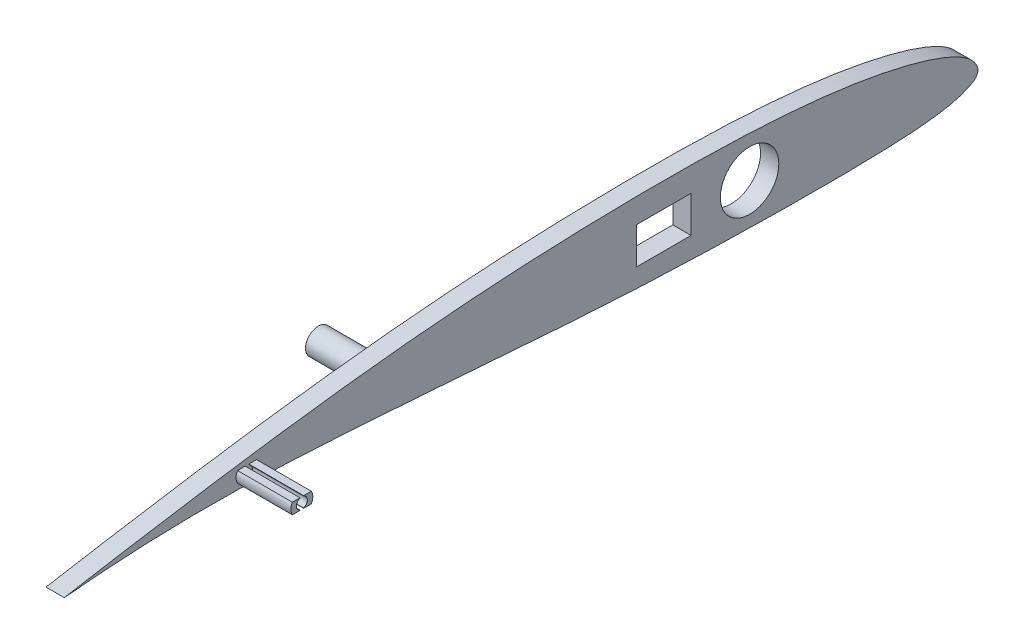
ISO-10303-21;
HEADER;
FILE_DESCRIPTION(('STEP AP214'),'2;1');
FILE_NAME('part.step','',(''),(''),'','','');
FILE_SCHEMA(('AUTOMOTIVE_DESIGN { 1 0 10303 214 1 1 1 1 }'));
ENDSEC;
DATA;
#1=APPLICATION_CONTEXT('core data for automotive mechanical design processes');
#2=APPLICATION_PROTOCOL_DEFINITION('international standard','automotive_design',2000,#1);
#3=PRODUCT_CONTEXT('',#1,'mechanical');
#4=PRODUCT('Part','Part','',(#3));
#5=PRODUCT_RELATED_PRODUCT_CATEGORY('part','',(#4));
#6=PRODUCT_DEFINITION_FORMATION('','',#4);
#7=PRODUCT_DEFINITION_CONTEXT('part definition',#1,'design');
#8=PRODUCT_DEFINITION('design','',#6,#7);
#9=PRODUCT_DEFINITION_SHAPE('','',#8);
#10=(LENGTH_UNIT() NAMED_UNIT(*) SI_UNIT(.MILLI.,.METRE.));
#11=(NAMED_UNIT(*) PLANE_ANGLE_UNIT() SI_UNIT($,.RADIAN.));
#12=(NAMED_UNIT(*) SI_UNIT($,.STERADIAN.) SOLID_ANGLE_UNIT());
#13=UNCERTAINTY_MEASURE_WITH_UNIT(LENGTH_MEASURE(1.E-05),#10,'distance_accuracy_value','');
#14=(GEOMETRIC_REPRESENTATION_CONTEXT(3) GLOBAL_UNCERTAINTY_ASSIGNED_CONTEXT((#13)) GLOBAL_UNIT_ASSIGNED_CONTEXT((#10,
#11,#12)) REPRESENTATION_CONTEXT('',''));
#15=CARTESIAN_POINT('',(0.,0.,0.));
#16=DIRECTION('',(0.,0.,1.));
#17=DIRECTION('',(1.,0.,0.));
#18=AXIS2_PLACEMENT_3D('',#15,#16,#17);
#19=CARTESIAN_POINT('',(5.,1.49711132773622,0.435092083404368));
#20=DIRECTION('',(-1.,0.,0.));
#21=DIRECTION('',(0.,0.,1.));
#22=AXIS2_PLACEMENT_3D('',#19,#20,#21);
#23=PLANE('',#22);
#24=CARTESIAN_POINT('',(5.,4.91748058964991,200.));
#25=DIRECTION('',(1.,0.,0.));
#26=DIRECTION('',(0.,0.,-1.));
#27=AXIS2_PLACEMENT_3D('',#24,#25,#26);
#28=CIRCLE('',#27,2.99999999999999);
#29=CARTESIAN_POINT('',(5.,6.41748058964991,202.598076211353));
#30=VERTEX_POINT('',#29);
#31=CARTESIAN_POINT('',(5.,3.41748058964991,202.598076211353));
#32=VERTEX_POINT('',#31);
#33=EDGE_CURVE('E168',#30,#32,#28,.T.);
#34=ORIENTED_EDGE('',*,*,#33,.F.);
#35=DIRECTION('',(0.,0.,1.));
#36=VECTOR('',#35,1.);
#37=CARTESIAN_POINT('',(5.,6.41748058964991,200.5));
#38=LINE('',#37,#36);
#39=CARTESIAN_POINT('',(5.,6.41748058964991,200.5));
#40=VERTEX_POINT('',#39);
#41=EDGE_CURVE('E181',#40,#30,#38,.T.);
#42=ORIENTED_EDGE('',*,*,#41,.F.);
#43=DIRECTION('',(0.,1.,0.));
#44=VECTOR('',#43,1.);
#45=CARTESIAN_POINT('',(5.,6.41748058964991,200.5));
#46=LINE('',#45,#44);
#47=CARTESIAN_POINT('',(5.,6.331694152023,200.5));
#48=VERTEX_POINT('',#47);
#49=EDGE_CURVE('E200',#48,#40,#46,.T.);
#50=ORIENTED_EDGE('',*,*,#49,.F.);
#51=CARTESIAN_POINT('',(5.,4.91748058964991,200.));
#52=DIRECTION('',(-1.,0.,0.));
#53=DIRECTION('',(0.,0.,-1.));
#54=AXIS2_PLACEMENT_3D('',#51,#52,#53);
#55=CIRCLE('',#54,1.5);
#56=CARTESIAN_POINT('',(5.,3.50326702727682,200.5));
#57=VERTEX_POINT('',#56);
#58=EDGE_CURVE('E197',#57,#48,#55,.T.);
#59=ORIENTED_EDGE('',*,*,#58,.F.);
#60=DIRECTION('',(0.,1.,0.));
#61=VECTOR('',#60,1.);
#62=CARTESIAN_POINT('',(5.,3.50326702727682,200.5));
#63=LINE('',#62,#61);
#64=CARTESIAN_POINT('',(5.,3.41748058964991,200.5));
#65=VERTEX_POINT('',#64);
#66=EDGE_CURVE('E194',#65,#57,#63,.T.);
#67=ORIENTED_EDGE('',*,*,#66,.F.);
#68=DIRECTION('',(0.,0.,-1.));
#69=VECTOR('',#68,1.);
#70=CARTESIAN_POINT('',(5.,3.41748058964991,200.5));
#71=LINE('',#70,#69);
#72=EDGE_CURVE('E171',#32,#65,#71,.T.);
#73=ORIENTED_EDGE('',*,*,#72,.F.);
#74=EDGE_LOOP('',(#34,#42,#50,#59,#67,#73));
#75=FACE_BOUND('',#74,.T.);
#76=CARTESIAN_POINT('',(5.,5.07732270373844,62.4999197093942));
#77=DIRECTION('',(1.,0.,0.));
#78=DIRECTION('',(0.,0.,-1.));
#79=AXIS2_PLACEMENT_3D('',#76,#77,#78);
#80=CIRCLE('',#79,8.);
#81=CARTESIAN_POINT('',(5.,5.07732270373844,54.4999197093942));
#82=VERTEX_POINT('',#81);
#83=EDGE_CURVE('E260',#82,#82,#80,.T.);
#84=ORIENTED_EDGE('',*,*,#83,.F.);
#85=EDGE_LOOP('',(#84));
#86=FACE_BOUND('',#85,.T.);
#87=CARTESIAN_POINT('',(5.,0.,250.));
#88=CARTESIAN_POINT('',(5.,-0.0080427959719715,250.000228293678));
#89=CARTESIAN_POINT('',(5.,0.172375657967406,248.284955515532));
#90=CARTESIAN_POINT('',(5.,0.308690014795419,246.518112419387));
#91=CARTESIAN_POINT('',(5.,0.685693593852336,242.189387343398));
#92=CARTESIAN_POINT('',(5.,1.07410152891603,236.806461263496));
#93=CARTESIAN_POINT('',(5.,1.49731723995003,229.680385951639));
#94=CARTESIAN_POINT('',(5.,1.8232186026768,221.18415869828));
#95=CARTESIAN_POINT('',(5.,1.96762610068065,211.337618207726));
#96=CARTESIAN_POINT('',(5.,1.83322105638369,200.371188527109));
#97=CARTESIAN_POINT('',(5.,1.38960528984164,188.499913622482));
#98=CARTESIAN_POINT('',(5.,0.706014078000893,175.953687417433));
#99=CARTESIAN_POINT('',(5.,-0.160208641561513,162.931424917666));
#100=CARTESIAN_POINT('',(5.,-1.14801632724376,149.615771743617));
#101=CARTESIAN_POINT('',(5.,-2.19092490983926,136.176354994724));
#102=CARTESIAN_POINT('',(5.,-3.21958397917046,122.767140548026));
#103=CARTESIAN_POINT('',(5.,-4.15274312671142,109.520053587455));
#104=CARTESIAN_POINT('',(5.,-4.93856436487493,96.5460959745437));
#105=CARTESIAN_POINT('',(5.,-5.53683070268675,83.9408193016427));
#106=CARTESIAN_POINT('',(5.,-5.94764820461108,71.8018392906514));
#107=CARTESIAN_POINT('',(5.,-6.21845093878312,60.2452560030716));
#108=CARTESIAN_POINT('',(5.,-6.35536975583973,49.3987328907547));
#109=CARTESIAN_POINT('',(5.,-6.38138796281789,39.3972261942655));
#110=CARTESIAN_POINT('',(5.,-6.26504923032313,30.3619348419668));
#111=CARTESIAN_POINT('',(5.,-6.01216491688521,22.4121811031587));
#112=CARTESIAN_POINT('',(5.,-5.59743390072595,15.6262272306516));
#113=CARTESIAN_POINT('',(5.,-4.92870657935606,10.0719075109048));
#114=CARTESIAN_POINT('',(5.,-4.04044698146404,5.69769261214423));
#115=CARTESIAN_POINT('',(5.,-2.8657529844069,2.62532063874475));
#116=CARTESIAN_POINT('',(5.,-1.7115284699546,0.494884225045661));
#117=CARTESIAN_POINT('',(5.,-0.410454230626488,-0.0213125491030087));
#118=CARTESIAN_POINT('',(5.,0.792659826704065,0.0311691995850224));
#119=CARTESIAN_POINT('',(5.,2.30568433693192,0.812599241892923));
#120=CARTESIAN_POINT('',(5.,4.23835242447377,2.72886351673443));
#121=CARTESIAN_POINT('',(5.,6.11817212106947,5.76990724125498));
#122=CARTESIAN_POINT('',(5.,7.91359420170391,9.88094280419771));
#123=CARTESIAN_POINT('',(5.,9.64131817838287,15.0749304677094));
#124=CARTESIAN_POINT('',(5.,11.2838964878058,21.2987522216172));
#125=CARTESIAN_POINT('',(5.,12.7883817585812,28.4971721202648));
#126=CARTESIAN_POINT('',(5.,14.0978349081275,36.6073734062479));
#127=CARTESIAN_POINT('',(5.,15.1594290171638,45.573028440303));
#128=CARTESIAN_POINT('',(5.,15.9609039979753,55.3329100744701));
#129=CARTESIAN_POINT('',(5.,16.4940697383882,65.8165364983871));
#130=CARTESIAN_POINT('',(5.,16.7919897051422,76.9313762604552));
#131=CARTESIAN_POINT('',(5.,16.864754130909,88.5669490281142));
#132=CARTESIAN_POINT('',(5.,16.7267152914356,100.596999885542));
#133=CARTESIAN_POINT('',(5.,16.3833850637257,112.888825982424));
#134=CARTESIAN_POINT('',(5.,15.825573666627,125.31161581915));
#135=CARTESIAN_POINT('',(5.,15.0523318700684,137.743791097076));
#136=CARTESIAN_POINT('',(5.,14.0593390742259,150.072384382085));
#137=CARTESIAN_POINT('',(5.,12.8815869860292,162.191375055682));
#138=CARTESIAN_POINT('',(5.,11.5492803460744,173.989074322246));
#139=CARTESIAN_POINT('',(5.,10.1162497290333,185.35236444642));
#140=CARTESIAN_POINT('',(5.,8.63237912523508,196.163081697706));
#141=CARTESIAN_POINT('',(5.,7.13151388385034,206.300441402258));
#142=CARTESIAN_POINT('',(5.,5.73122176805054,215.560350587015));
#143=CARTESIAN_POINT('',(5.,4.29329512716244,223.97715704258));
#144=CARTESIAN_POINT('',(5.,3.1818088737293,231.363413336396));
#145=CARTESIAN_POINT('',(5.,2.09894241729889,237.746440904332));
#146=CARTESIAN_POINT('',(5.,1.2458619166603,242.622069365861));
#147=CARTESIAN_POINT('',(5.,0.552864946230777,246.64452933247));
#148=CARTESIAN_POINT('',(5.,0.246216764640028,248.328398440367));
#149=CARTESIAN_POINT('',(5.,0.00797737724443801,249.999773563223));
#150=CARTESIAN_POINT('',(5.,0.,250.));
#151=B_SPLINE_CURVE_WITH_KNOTS('',3,(#87,#88,#89,#90,#91,#92,#93,#94,#95,#96,#97,#98,#99,#100,
#101,#102,#103,#104,#105,#106,#107,#108,#109,#110,#111,#112,#113,#114,#115,#116,#117,#118,#119,
#120,#121,#122,#123,#124,#125,#126,#127,#128,#129,#130,#131,#132,#133,#134,#135,#136,#137,#138,
#139,#140,#141,#142,#143,#144,#145,#146,#147,#148,#149,#150),.UNSPECIFIED.,.T.,.F.,(4,1,1,1,1,1,
1,1,1,1,1,1,1,1,1,1,1,1,1,1,1,1,1,1,1,1,1,1,1,1,1,1,1,1,1,1,1,1,1,1,1,1,1,1,1,1,1,1,1,1,1,1,1,1,
1,1,1,1,1,1,1,4),(0.,0.00158888881614516,0.00632921783555629,0.0142024564897436,
0.0251728077530557,0.0391734833267743,0.0560606311759249,0.0755789238487882,0.0973636066296903,
0.120926258366677,0.145825281006277,0.171670911815127,0.198108536705041,0.22479018357162,
0.25139057978404,0.277643490654311,0.303326750051388,0.328257458029316,0.352272548115194,
0.375156061746876,0.396620664402003,0.416422729294005,0.434304420097656,0.450054679859308,
0.463465465082325,0.474478994238096,0.483169222153171,0.489678354497499,0.494104066315722,
0.496910015324886,0.497289784891853,0.501214273282496,0.506457950332762,0.51335695674223,
0.522168631834455,0.53296596992453,0.545689209241574,0.56022077890382,0.57643892310517,
0.594258689005965,0.613600244568652,0.634342385932902,0.656331109263004,0.679351893859712,
0.703152302846811,0.727478208080039,0.7520707394079,0.776691163534608,0.801140183976245,
0.825214386971546,0.848697423570622,0.871352857669295,0.892947448931157,0.913230871058069,
0.931955467148994,0.94834206907442,0.963693004275676,0.976235918239566,0.986320058750392,
0.993788799349345,0.998424034933867,1.),.UNSPECIFIED.);
#152=CARTESIAN_POINT('',(5.,0.,250.));
#153=VERTEX_POINT('',#152);
#154=EDGE_CURVE('E11',#153,#153,#151,.T.);
#155=ORIENTED_EDGE('',*,*,#154,.T.);
#156=EDGE_LOOP('',(#155));
#157=FACE_BOUND('',#156,.T.);
#158=DIRECTION('',(0.,1.,0.));
#159=VECTOR('',#158,1.);
#160=CARTESIAN_POINT('',(5.,10.0773227037384,78.4999197093942));
#161=LINE('',#160,#159);
#162=CARTESIAN_POINT('',(5.,0.0773227037384437,78.4999197093942));
#163=VERTEX_POINT('',#162);
#164=CARTESIAN_POINT('',(5.,10.0773227037384,78.4999197093942));
#165=VERTEX_POINT('',#164);
#166=EDGE_CURVE('E229',#163,#165,#161,.T.);
#167=ORIENTED_EDGE('',*,*,#166,.F.);
#168=DIRECTION('',(0.,0.,-1.));
#169=VECTOR('',#168,1.);
#170=CARTESIAN_POINT('',(5.,0.0773227037384437,78.4999197093942));
#171=LINE('',#170,#169);
#172=CARTESIAN_POINT('',(5.,0.0773227037384437,93.4999197093942));
#173=VERTEX_POINT('',#172);
#174=EDGE_CURVE('E237',#173,#163,#171,.T.);
#175=ORIENTED_EDGE('',*,*,#174,.F.);
#176=DIRECTION('',(0.,-1.,0.));
#177=VECTOR('',#176,1.);
#178=CARTESIAN_POINT('',(5.,10.0773227037384,93.4999197093942));
#179=LINE('',#178,#177);
#180=CARTESIAN_POINT('',(5.,10.0773227037384,93.4999197093942));
#181=VERTEX_POINT('',#180);
#182=EDGE_CURVE('E234',#181,#173,#179,.T.);
#183=ORIENTED_EDGE('',*,*,#182,.F.);
#184=DIRECTION('',(0.,0.,1.));
#185=VECTOR('',#184,1.);
#186=CARTESIAN_POINT('',(5.,10.0773227037384,78.4999197093942));
#187=LINE('',#186,#185);
#188=EDGE_CURVE('E231',#165,#181,#187,.T.);
#189=ORIENTED_EDGE('',*,*,#188,.F.);
#190=EDGE_LOOP('',(#167,#175,#183,#189));
#191=FACE_BOUND('',#190,.T.);
#192=CARTESIAN_POINT('',(5.,4.91748058964991,200.));
#193=DIRECTION('',(1.,0.,0.));
#194=DIRECTION('',(0.,0.,-1.));
#195=AXIS2_PLACEMENT_3D('',#192,#193,#194);
#196=CIRCLE('',#195,2.99999999999999);
#197=CARTESIAN_POINT('',(5.,3.41748058964991,197.401923788647));
#198=VERTEX_POINT('',#197);
#199=CARTESIAN_POINT('',(5.,6.41748058964991,197.401923788647));
#200=VERTEX_POINT('',#199);
#201=EDGE_CURVE('E167',#198,#200,#196,.T.);
#202=ORIENTED_EDGE('',*,*,#201,.F.);
#203=DIRECTION('',(0.,0.,-1.));
#204=VECTOR('',#203,1.);
#205=CARTESIAN_POINT('',(5.,3.41748058964991,197.401923788647));
#206=LINE('',#205,#204);
#207=CARTESIAN_POINT('',(5.,3.41748058964991,199.5));
#208=VERTEX_POINT('',#207);
#209=EDGE_CURVE('E164',#208,#198,#206,.T.);
#210=ORIENTED_EDGE('',*,*,#209,.F.);
#211=DIRECTION('',(0.,-1.,0.));
#212=VECTOR('',#211,1.);
#213=CARTESIAN_POINT('',(5.,3.50326702727681,199.5));
#214=LINE('',#213,#212);
#215=CARTESIAN_POINT('',(5.,3.50326702727681,199.5));
#216=VERTEX_POINT('',#215);
#217=EDGE_CURVE('E312',#216,#208,#214,.T.);
#218=ORIENTED_EDGE('',*,*,#217,.F.);
#219=CARTESIAN_POINT('',(5.,4.91748058964991,200.));
#220=DIRECTION('',(-1.,0.,0.));
#221=DIRECTION('',(0.,0.,-1.));
#222=AXIS2_PLACEMENT_3D('',#219,#220,#221);
#223=CIRCLE('',#222,1.5);
#224=CARTESIAN_POINT('',(5.,6.33169415202301,199.5));
#225=VERTEX_POINT('',#224);
#226=EDGE_CURVE('E329',#225,#216,#223,.T.);
#227=ORIENTED_EDGE('',*,*,#226,.F.);
#228=DIRECTION('',(0.,-1.,0.));
#229=VECTOR('',#228,1.);
#230=CARTESIAN_POINT('',(5.,6.41748058964991,199.5));
#231=LINE('',#230,#229);
#232=CARTESIAN_POINT('',(5.,6.41748058964991,199.5));
#233=VERTEX_POINT('',#232);
#234=EDGE_CURVE('E54',#233,#225,#231,.T.);
#235=ORIENTED_EDGE('',*,*,#234,.F.);
#236=DIRECTION('',(0.,0.,1.));
#237=VECTOR('',#236,1.);
#238=CARTESIAN_POINT('',(5.,6.41748058964991,197.401923788647));
#239=LINE('',#238,#237);
#240=EDGE_CURVE('E49',#200,#233,#239,.T.);
#241=ORIENTED_EDGE('',*,*,#240,.F.);
#242=EDGE_LOOP('',(#202,#210,#218,#227,#235,#241));
#243=FACE_BOUND('',#242,.T.);
#244=ADVANCED_FACE('F32',(#75,#86,#157,#191,#243),#23,.F.);
#245=CARTESIAN_POINT('',(0.,1.49711132773622,0.435092083404368));
#246=DIRECTION('',(-1.,0.,0.));
#247=DIRECTION('',(0.,0.,1.));
#248=AXIS2_PLACEMENT_3D('',#245,#246,#247);
#249=PLANE('',#248);
#250=CARTESIAN_POINT('',(0.,6.07732270373844,160.499919709394));
#251=DIRECTION('',(-1.,0.,0.));
#252=DIRECTION('',(0.,0.,1.));
#253=AXIS2_PLACEMENT_3D('',#250,#251,#252);
#254=CIRCLE('',#253,3.49999999999999);
#255=CARTESIAN_POINT('',(0.,6.07732270373844,163.999919709394));
#256=VERTEX_POINT('',#255);
#257=EDGE_CURVE('E222',#256,#256,#254,.T.);
#258=ORIENTED_EDGE('',*,*,#257,.F.);
#259=EDGE_LOOP('',(#258));
#260=FACE_BOUND('',#259,.T.);
#261=CARTESIAN_POINT('',(0.,0.,250.));
#262=CARTESIAN_POINT('',(0.,-0.0080427959719715,250.000228293678));
#263=CARTESIAN_POINT('',(0.,0.172375657967406,248.284955515532));
#264=CARTESIAN_POINT('',(0.,0.308690014795419,246.518112419387));
#265=CARTESIAN_POINT('',(0.,0.685693593852336,242.189387343398));
#266=CARTESIAN_POINT('',(0.,1.07410152891603,236.806461263496));
#267=CARTESIAN_POINT('',(0.,1.49731723995003,229.680385951639));
#268=CARTESIAN_POINT('',(0.,1.8232186026768,221.18415869828));
#269=CARTESIAN_POINT('',(0.,1.96762610068065,211.337618207726));
#270=CARTESIAN_POINT('',(0.,1.83322105638369,200.371188527109));
#271=CARTESIAN_POINT('',(0.,1.38960528984164,188.499913622482));
#272=CARTESIAN_POINT('',(0.,0.706014078000893,175.953687417433));
#273=CARTESIAN_POINT('',(0.,-0.160208641561513,162.931424917666));
#274=CARTESIAN_POINT('',(0.,-1.14801632724376,149.615771743617));
#275=CARTESIAN_POINT('',(0.,-2.19092490983926,136.176354994724));
#276=CARTESIAN_POINT('',(0.,-3.21958397917046,122.767140548026));
#277=CARTESIAN_POINT('',(0.,-4.15274312671142,109.520053587455));
#278=CARTESIAN_POINT('',(0.,-4.93856436487493,96.5460959745437));
#279=CARTESIAN_POINT('',(0.,-5.53683070268675,83.9408193016427));
#280=CARTESIAN_POINT('',(0.,-5.94764820461108,71.8018392906514));
#281=CARTESIAN_POINT('',(0.,-6.21845093878312,60.2452560030716));
#282=CARTESIAN_POINT('',(0.,-6.35536975583973,49.3987328907547));
#283=CARTESIAN_POINT('',(0.,-6.38138796281789,39.3972261942655));
#284=CARTESIAN_POINT('',(0.,-6.26504923032313,30.3619348419668));
#285=CARTESIAN_POINT('',(0.,-6.01216491688521,22.4121811031587));
#286=CARTESIAN_POINT('',(0.,-5.59743390072595,15.6262272306516));
#287=CARTESIAN_POINT('',(0.,-4.92870657935606,10.0719075109048));
#288=CARTESIAN_POINT('',(0.,-4.04044698146404,5.69769261214423));
#289=CARTESIAN_POINT('',(0.,-2.8657529844069,2.62532063874475));
#290=CARTESIAN_POINT('',(0.,-1.7115284699546,0.494884225045661));
#291=CARTESIAN_POINT('',(0.,-0.410454230626488,-0.0213125491030087));
#292=CARTESIAN_POINT('',(0.,0.792659826704065,0.0311691995850224));
#293=CARTESIAN_POINT('',(0.,2.30568433693192,0.812599241892923));
#294=CARTESIAN_POINT('',(0.,4.23835242447377,2.72886351673443));
#295=CARTESIAN_POINT('',(0.,6.11817212106947,5.76990724125498));
#296=CARTESIAN_POINT('',(0.,7.91359420170391,9.88094280419771));
#297=CARTESIAN_POINT('',(0.,9.64131817838287,15.0749304677094));
#298=CARTESIAN_POINT('',(0.,11.2838964878058,21.2987522216172));
#299=CARTESIAN_POINT('',(0.,12.7883817585812,28.4971721202648));
#300=CARTESIAN_POINT('',(0.,14.0978349081275,36.6073734062479));
#301=CARTESIAN_POINT('',(0.,15.1594290171638,45.573028440303));
#302=CARTESIAN_POINT('',(0.,15.9609039979753,55.3329100744701));
#303=CARTESIAN_POINT('',(0.,16.4940697383882,65.8165364983871));
#304=CARTESIAN_POINT('',(0.,16.7919897051422,76.9313762604552));
#305=CARTESIAN_POINT('',(0.,16.864754130909,88.5669490281142));
#306=CARTESIAN_POINT('',(0.,16.7267152914356,100.596999885542));
#307=CARTESIAN_POINT('',(0.,16.3833850637257,112.888825982424));
#308=CARTESIAN_POINT('',(0.,15.825573666627,125.31161581915));
#309=CARTESIAN_POINT('',(0.,15.0523318700684,137.743791097076));
#310=CARTESIAN_POINT('',(0.,14.0593390742259,150.072384382085));
#311=CARTESIAN_POINT('',(0.,12.8815869860292,162.191375055682));
#312=CARTESIAN_POINT('',(0.,11.5492803460744,173.989074322246));
#313=CARTESIAN_POINT('',(0.,10.1162497290333,185.35236444642));
#314=CARTESIAN_POINT('',(0.,8.63237912523508,196.163081697706));
#315=CARTESIAN_POINT('',(0.,7.13151388385034,206.300441402258));
#316=CARTESIAN_POINT('',(0.,5.73122176805054,215.560350587015));
#317=CARTESIAN_POINT('',(0.,4.29329512716244,223.97715704258));
#318=CARTESIAN_POINT('',(0.,3.1818088737293,231.363413336396));
#319=CARTESIAN_POINT('',(0.,2.09894241729889,237.746440904332));
#320=CARTESIAN_POINT('',(0.,1.2458619166603,242.622069365861));
#321=CARTESIAN_POINT('',(0.,0.552864946230777,246.64452933247));
#322=CARTESIAN_POINT('',(0.,0.246216764640028,248.328398440367));
#323=CARTESIAN_POINT('',(0.,0.00797737724443801,249.999773563223));
#324=CARTESIAN_POINT('',(0.,0.,250.));
#325=B_SPLINE_CURVE_WITH_KNOTS('',3,(#261,#262,#263,#264,#265,#266,#267,#268,#269,#270,#271,
#272,#273,#274,#275,#276,#277,#278,#279,#280,#281,#282,#283,#284,#285,#286,#287,#288,#289,#290,
#291,#292,#293,#294,#295,#296,#297,#298,#299,#300,#301,#302,#303,#304,#305,#306,#307,#308,#309,
#310,#311,#312,#313,#314,#315,#316,#317,#318,#319,#320,#321,#322,#323,#324),.UNSPECIFIED.,.T.,
.F.,(4,1,1,1,1,1,1,1,1,1,1,1,1,1,1,1,1,1,1,1,1,1,1,1,1,1,1,1,1,1,1,1,1,1,1,1,1,1,1,1,1,1,1,1,1,
1,1,1,1,1,1,1,1,1,1,1,1,1,1,1,1,4),(0.,0.00158888881614516,0.00632921783555629,
0.0142024564897436,0.0251728077530557,0.0391734833267743,0.0560606311759249,0.0755789238487882,
0.0973636066296903,0.120926258366677,0.145825281006277,0.171670911815127,0.198108536705041,
0.22479018357162,0.25139057978404,0.277643490654311,0.303326750051388,0.328257458029316,
0.352272548115194,0.375156061746876,0.396620664402003,0.416422729294005,0.434304420097656,
0.450054679859308,0.463465465082325,0.474478994238096,0.483169222153171,0.489678354497499,
0.494104066315722,0.496910015324886,0.497289784891853,0.501214273282496,0.506457950332762,
0.51335695674223,0.522168631834455,0.53296596992453,0.545689209241574,0.56022077890382,
0.57643892310517,0.594258689005965,0.613600244568652,0.634342385932902,0.656331109263004,
0.679351893859712,0.703152302846811,0.727478208080039,0.7520707394079,0.776691163534608,
0.801140183976245,0.825214386971546,0.848697423570622,0.871352857669295,0.892947448931157,
0.913230871058069,0.931955467148994,0.94834206907442,0.963693004275676,0.976235918239566,
0.986320058750392,0.993788799349345,0.998424034933867,1.),.UNSPECIFIED.);
#326=CARTESIAN_POINT('',(0.,0.,250.));
#327=VERTEX_POINT('',#326);
#328=EDGE_CURVE('E37',#327,#327,#325,.T.);
#329=ORIENTED_EDGE('',*,*,#328,.F.);
#330=EDGE_LOOP('',(#329));
#331=FACE_BOUND('',#330,.T.);
#332=CARTESIAN_POINT('',(0.,5.07732270373844,62.4999197093942));
#333=DIRECTION('',(1.,0.,0.));
#334=DIRECTION('',(0.,0.,-1.));
#335=AXIS2_PLACEMENT_3D('',#332,#333,#334);
#336=CIRCLE('',#335,8.);
#337=CARTESIAN_POINT('',(0.,5.07732270373844,54.4999197093942));
#338=VERTEX_POINT('',#337);
#339=EDGE_CURVE('E259',#338,#338,#336,.T.);
#340=ORIENTED_EDGE('',*,*,#339,.T.);
#341=EDGE_LOOP('',(#340));
#342=FACE_BOUND('',#341,.T.);
#343=DIRECTION('',(0.,0.,-1.));
#344=VECTOR('',#343,1.);
#345=CARTESIAN_POINT('',(0.,0.0773227037384437,78.4999197093942));
#346=LINE('',#345,#344);
#347=CARTESIAN_POINT('',(0.,0.0773227037384437,93.4999197093942));
#348=VERTEX_POINT('',#347);
#349=CARTESIAN_POINT('',(0.,0.0773227037384437,78.4999197093942));
#350=VERTEX_POINT('',#349);
#351=EDGE_CURVE('E232',#348,#350,#346,.T.);
#352=ORIENTED_EDGE('',*,*,#351,.T.);
#353=DIRECTION('',(0.,1.,0.));
#354=VECTOR('',#353,1.);
#355=CARTESIAN_POINT('',(0.,10.0773227037384,78.4999197093942));
#356=LINE('',#355,#354);
#357=CARTESIAN_POINT('',(0.,10.0773227037384,78.4999197093942));
#358=VERTEX_POINT('',#357);
#359=EDGE_CURVE('E226',#350,#358,#356,.T.);
#360=ORIENTED_EDGE('',*,*,#359,.T.);
#361=DIRECTION('',(0.,0.,1.));
#362=VECTOR('',#361,1.);
#363=CARTESIAN_POINT('',(0.,10.0773227037384,78.4999197093942));
#364=LINE('',#363,#362);
#365=CARTESIAN_POINT('',(0.,10.0773227037384,93.4999197093942));
#366=VERTEX_POINT('',#365);
#367=EDGE_CURVE('E242',#358,#366,#364,.T.);
#368=ORIENTED_EDGE('',*,*,#367,.T.);
#369=DIRECTION('',(0.,-1.,0.));
#370=VECTOR('',#369,1.);
#371=CARTESIAN_POINT('',(0.,10.0773227037384,93.4999197093942));
#372=LINE('',#371,#370);
#373=EDGE_CURVE('E245',#366,#348,#372,.T.);
#374=ORIENTED_EDGE('',*,*,#373,.T.);
#375=EDGE_LOOP('',(#352,#360,#368,#374));
#376=FACE_BOUND('',#375,.T.);
#377=ADVANCED_FACE('F272',(#260,#331,#342,#376),#249,.T.);
#378=DIRECTION('',(-1.,0.,0.));
#379=VECTOR('',#378,1.);
#380=SURFACE_OF_LINEAR_EXTRUSION('',#151,#379);
#381=ORIENTED_EDGE('',*,*,#154,.F.);
#382=EDGE_LOOP('',(#381));
#383=FACE_BOUND('',#382,.T.);
#384=ORIENTED_EDGE('',*,*,#328,.T.);
#385=EDGE_LOOP('',(#384));
#386=FACE_BOUND('',#385,.T.);
#387=ADVANCED_FACE('F34',(#383,#386),#380,.F.);
#388=CARTESIAN_POINT('',(5.,5.07732270373844,62.4999197093942));
#389=DIRECTION('',(-1.,0.,0.));
#390=DIRECTION('',(0.,0.,1.));
#391=AXIS2_PLACEMENT_3D('',#388,#389,#390);
#392=CYLINDRICAL_SURFACE('',#391,8.);
#393=ORIENTED_EDGE('',*,*,#83,.T.);
#394=EDGE_LOOP('',(#393));
#395=FACE_BOUND('',#394,.T.);
#396=ORIENTED_EDGE('',*,*,#339,.F.);
#397=EDGE_LOOP('',(#396));
#398=FACE_BOUND('',#397,.T.);
#399=ADVANCED_FACE('F275',(#395,#398),#392,.F.);
#400=CARTESIAN_POINT('',(5.,10.0773227037384,78.4999197093942));
#401=DIRECTION('',(0.,0.,1.));
#402=DIRECTION('',(1.,0.,0.));
#403=AXIS2_PLACEMENT_3D('',#400,#401,#402);
#404=PLANE('',#403);
#405=ORIENTED_EDGE('',*,*,#359,.F.);
#406=DIRECTION('',(-1.,0.,0.));
#407=VECTOR('',#406,1.);
#408=CARTESIAN_POINT('',(5.,0.0773227037384437,78.4999197093942));
#409=LINE('',#408,#407);
#410=EDGE_CURVE('E239',#163,#350,#409,.T.);
#411=ORIENTED_EDGE('',*,*,#410,.F.);
#412=ORIENTED_EDGE('',*,*,#166,.T.);
#413=DIRECTION('',(-1.,0.,0.));
#414=VECTOR('',#413,1.);
#415=CARTESIAN_POINT('',(5.,10.0773227037384,78.4999197093942));
#416=LINE('',#415,#414);
#417=EDGE_CURVE('E256',#165,#358,#416,.T.);
#418=ORIENTED_EDGE('',*,*,#417,.T.);
#419=EDGE_LOOP('',(#405,#411,#412,#418));
#420=FACE_BOUND('',#419,.T.);
#421=ADVANCED_FACE('F277',(#420),#404,.T.);
#422=CARTESIAN_POINT('',(5.,10.0773227037384,78.4999197093942));
#423=DIRECTION('',(0.,-1.,0.));
#424=DIRECTION('',(0.,0.,-1.));
#425=AXIS2_PLACEMENT_3D('',#422,#423,#424);
#426=PLANE('',#425);
#427=ORIENTED_EDGE('',*,*,#367,.F.);
#428=ORIENTED_EDGE('',*,*,#417,.F.);
#429=ORIENTED_EDGE('',*,*,#188,.T.);
#430=DIRECTION('',(-1.,0.,0.));
#431=VECTOR('',#430,1.);
#432=CARTESIAN_POINT('',(5.,10.0773227037384,93.4999197093942));
#433=LINE('',#432,#431);
#434=EDGE_CURVE('E254',#181,#366,#433,.T.);
#435=ORIENTED_EDGE('',*,*,#434,.T.);
#436=EDGE_LOOP('',(#427,#428,#429,#435));
#437=FACE_BOUND('',#436,.T.);
#438=ADVANCED_FACE('F284',(#437),#426,.T.);
#439=CARTESIAN_POINT('',(5.,10.0773227037384,93.4999197093942));
#440=DIRECTION('',(0.,0.,-1.));
#441=DIRECTION('',(-1.,0.,0.));
#442=AXIS2_PLACEMENT_3D('',#439,#440,#441);
#443=PLANE('',#442);
#444=ORIENTED_EDGE('',*,*,#373,.F.);
#445=ORIENTED_EDGE('',*,*,#434,.F.);
#446=ORIENTED_EDGE('',*,*,#182,.T.);
#447=DIRECTION('',(-1.,0.,0.));
#448=VECTOR('',#447,1.);
#449=CARTESIAN_POINT('',(5.,0.0773227037384437,93.4999197093942));
#450=LINE('',#449,#448);
#451=EDGE_CURVE('E252',#173,#348,#450,.T.);
#452=ORIENTED_EDGE('',*,*,#451,.T.);
#453=EDGE_LOOP('',(#444,#445,#446,#452));
#454=FACE_BOUND('',#453,.T.);
#455=ADVANCED_FACE('F397',(#454),#443,.T.);
#456=CARTESIAN_POINT('',(5.,0.0773227037384437,78.4999197093942));
#457=DIRECTION('',(0.,1.,0.));
#458=DIRECTION('',(0.,0.,1.));
#459=AXIS2_PLACEMENT_3D('',#456,#457,#458);
#460=PLANE('',#459);
#461=ORIENTED_EDGE('',*,*,#351,.F.);
#462=ORIENTED_EDGE('',*,*,#451,.F.);
#463=ORIENTED_EDGE('',*,*,#174,.T.);
#464=ORIENTED_EDGE('',*,*,#410,.T.);
#465=EDGE_LOOP('',(#461,#462,#463,#464));
#466=FACE_BOUND('',#465,.T.);
#467=ADVANCED_FACE('F393',(#466),#460,.T.);
#468=CARTESIAN_POINT('',(-15.,6.07732270373844,160.499919709394));
#469=DIRECTION('',(1.,0.,0.));
#470=DIRECTION('',(0.,0.,-1.));
#471=AXIS2_PLACEMENT_3D('',#468,#469,#470);
#472=CYLINDRICAL_SURFACE('',#471,3.49999999999999);
#473=CARTESIAN_POINT('',(-15.,6.07732270373844,160.499919709394));
#474=DIRECTION('',(-1.,0.,0.));
#475=DIRECTION('',(0.,0.,1.));
#476=AXIS2_PLACEMENT_3D('',#473,#474,#475);
#477=CIRCLE('',#476,3.49999999999999);
#478=CARTESIAN_POINT('',(-15.,6.07732270373844,163.999919709394));
#479=VERTEX_POINT('',#478);
#480=EDGE_CURVE('E223',#479,#479,#477,.T.);
#481=ORIENTED_EDGE('',*,*,#480,.F.);
#482=EDGE_LOOP('',(#481));
#483=FACE_BOUND('',#482,.T.);
#484=ORIENTED_EDGE('',*,*,#257,.T.);
#485=EDGE_LOOP('',(#484));
#486=FACE_BOUND('',#485,.T.);
#487=ADVANCED_FACE('F389',(#483,#486),#472,.T.);
#488=CARTESIAN_POINT('',(-15.,6.07732270373844,160.499919709394));
#489=DIRECTION('',(-1.,0.,0.));
#490=DIRECTION('',(0.,0.,1.));
#491=AXIS2_PLACEMENT_3D('',#488,#489,#490);
#492=PLANE('',#491);
#493=ORIENTED_EDGE('',*,*,#480,.T.);
#494=EDGE_LOOP('',(#493));
#495=FACE_BOUND('',#494,.T.);
#496=ADVANCED_FACE('F385',(#495),#492,.T.);
#497=CARTESIAN_POINT('',(20.,4.91748058964991,200.));
#498=DIRECTION('',(-1.,0.,0.));
#499=DIRECTION('',(0.,0.,1.));
#500=AXIS2_PLACEMENT_3D('',#497,#498,#499);
#501=CYLINDRICAL_SURFACE('',#500,2.99999999999999);
#502=ORIENTED_EDGE('',*,*,#33,.T.);
#503=DIRECTION('',(-1.,0.,0.));
#504=VECTOR('',#503,1.);
#505=CARTESIAN_POINT('',(20.,3.41748058964991,202.598076211353));
#506=LINE('',#505,#504);
#507=CARTESIAN_POINT('',(20.,3.41748058964991,202.598076211353));
#508=VERTEX_POINT('',#507);
#509=EDGE_CURVE('E219',#508,#32,#506,.T.);
#510=ORIENTED_EDGE('',*,*,#509,.F.);
#511=CARTESIAN_POINT('',(20.,4.91748058964991,200.));
#512=DIRECTION('',(1.,0.,0.));
#513=DIRECTION('',(0.,0.,-1.));
#514=AXIS2_PLACEMENT_3D('',#511,#512,#513);
#515=CIRCLE('',#514,2.99999999999999);
#516=CARTESIAN_POINT('',(20.,6.41748058964991,202.598076211353));
#517=VERTEX_POINT('',#516);
#518=EDGE_CURVE('E177',#517,#508,#515,.T.);
#519=ORIENTED_EDGE('',*,*,#518,.F.);
#520=DIRECTION('',(-1.,0.,0.));
#521=VECTOR('',#520,1.);
#522=CARTESIAN_POINT('',(20.,6.41748058964991,202.598076211353));
#523=LINE('',#522,#521);
#524=EDGE_CURVE('E190',#517,#30,#523,.T.);
#525=ORIENTED_EDGE('',*,*,#524,.T.);
#526=EDGE_LOOP('',(#502,#510,#519,#525));
#527=FACE_BOUND('',#526,.T.);
#528=ADVANCED_FACE('F381',(#527),#501,.T.);
#529=CARTESIAN_POINT('',(20.,3.41748058964991,200.5));
#530=DIRECTION('',(0.,1.,0.));
#531=DIRECTION('',(0.,0.,1.));
#532=AXIS2_PLACEMENT_3D('',#529,#530,#531);
#533=PLANE('',#532);
#534=ORIENTED_EDGE('',*,*,#72,.T.);
#535=DIRECTION('',(-1.,0.,0.));
#536=VECTOR('',#535,1.);
#537=CARTESIAN_POINT('',(20.,3.41748058964991,200.5));
#538=LINE('',#537,#536);
#539=CARTESIAN_POINT('',(20.,3.41748058964991,200.5));
#540=VERTEX_POINT('',#539);
#541=EDGE_CURVE('E216',#540,#65,#538,.T.);
#542=ORIENTED_EDGE('',*,*,#541,.F.);
#543=DIRECTION('',(0.,0.,-1.));
#544=VECTOR('',#543,1.);
#545=CARTESIAN_POINT('',(20.,3.41748058964991,200.5));
#546=LINE('',#545,#544);
#547=EDGE_CURVE('E180',#508,#540,#546,.T.);
#548=ORIENTED_EDGE('',*,*,#547,.F.);
#549=ORIENTED_EDGE('',*,*,#509,.T.);
#550=EDGE_LOOP('',(#534,#542,#548,#549));
#551=FACE_BOUND('',#550,.T.);
#552=ADVANCED_FACE('F377',(#551),#533,.F.);
#553=CARTESIAN_POINT('',(20.,3.50326702727682,200.5));
#554=DIRECTION('',(0.,0.,1.));
#555=DIRECTION('',(1.,0.,0.));
#556=AXIS2_PLACEMENT_3D('',#553,#554,#555);
#557=PLANE('',#556);
#558=ORIENTED_EDGE('',*,*,#66,.T.);
#559=DIRECTION('',(-1.,0.,0.));
#560=VECTOR('',#559,1.);
#561=CARTESIAN_POINT('',(20.,3.50326702727682,200.5));
#562=LINE('',#561,#560);
#563=CARTESIAN_POINT('',(20.,3.50326702727682,200.5));
#564=VERTEX_POINT('',#563);
#565=EDGE_CURVE('E213',#564,#57,#562,.T.);
#566=ORIENTED_EDGE('',*,*,#565,.F.);
#567=DIRECTION('',(0.,1.,0.));
#568=VECTOR('',#567,1.);
#569=CARTESIAN_POINT('',(20.,3.50326702727682,200.5));
#570=LINE('',#569,#568);
#571=EDGE_CURVE('E183',#540,#564,#570,.T.);
#572=ORIENTED_EDGE('',*,*,#571,.F.);
#573=ORIENTED_EDGE('',*,*,#541,.T.);
#574=EDGE_LOOP('',(#558,#566,#572,#573));
#575=FACE_BOUND('',#574,.T.);
#576=ADVANCED_FACE('F373',(#575),#557,.F.);
#577=CARTESIAN_POINT('',(20.,4.91748058964991,200.));
#578=DIRECTION('',(-1.,0.,0.));
#579=DIRECTION('',(0.,0.,1.));
#580=AXIS2_PLACEMENT_3D('',#577,#578,#579);
#581=CYLINDRICAL_SURFACE('',#580,1.5);
#582=ORIENTED_EDGE('',*,*,#58,.T.);
#583=DIRECTION('',(-1.,0.,0.));
#584=VECTOR('',#583,1.);
#585=CARTESIAN_POINT('',(20.,6.331694152023,200.5));
#586=LINE('',#585,#584);
#587=CARTESIAN_POINT('',(20.,6.331694152023,200.5));
#588=VERTEX_POINT('',#587);
#589=EDGE_CURVE('E210',#588,#48,#586,.T.);
#590=ORIENTED_EDGE('',*,*,#589,.F.);
#591=CARTESIAN_POINT('',(20.,4.91748058964991,200.));
#592=DIRECTION('',(-1.,0.,0.));
#593=DIRECTION('',(0.,0.,-1.));
#594=AXIS2_PLACEMENT_3D('',#591,#592,#593);
#595=CIRCLE('',#594,1.5);
#596=EDGE_CURVE('E185',#564,#588,#595,.T.);
#597=ORIENTED_EDGE('',*,*,#596,.F.);
#598=ORIENTED_EDGE('',*,*,#565,.T.);
#599=EDGE_LOOP('',(#582,#590,#597,#598));
#600=FACE_BOUND('',#599,.T.);
#601=ADVANCED_FACE('F369',(#600),#581,.F.);
#602=CARTESIAN_POINT('',(20.,6.41748058964991,200.5));
#603=DIRECTION('',(0.,0.,1.));
#604=DIRECTION('',(1.,0.,0.));
#605=AXIS2_PLACEMENT_3D('',#602,#603,#604);
#606=PLANE('',#605);
#607=ORIENTED_EDGE('',*,*,#49,.T.);
#608=DIRECTION('',(-1.,0.,0.));
#609=VECTOR('',#608,1.);
#610=CARTESIAN_POINT('',(20.,6.41748058964991,200.5));
#611=LINE('',#610,#609);
#612=CARTESIAN_POINT('',(20.,6.41748058964991,200.5));
#613=VERTEX_POINT('',#612);
#614=EDGE_CURVE('E207',#613,#40,#611,.T.);
#615=ORIENTED_EDGE('',*,*,#614,.F.);
#616=DIRECTION('',(0.,1.,0.));
#617=VECTOR('',#616,1.);
#618=CARTESIAN_POINT('',(20.,6.41748058964991,200.5));
#619=LINE('',#618,#617);
#620=EDGE_CURVE('E187',#588,#613,#619,.T.);
#621=ORIENTED_EDGE('',*,*,#620,.F.);
#622=ORIENTED_EDGE('',*,*,#589,.T.);
#623=EDGE_LOOP('',(#607,#615,#621,#622));
#624=FACE_BOUND('',#623,.T.);
#625=ADVANCED_FACE('F365',(#624),#606,.F.);
#626=CARTESIAN_POINT('',(20.,6.41748058964991,200.5));
#627=DIRECTION('',(0.,-1.,0.));
#628=DIRECTION('',(0.,0.,-1.));
#629=AXIS2_PLACEMENT_3D('',#626,#627,#628);
#630=PLANE('',#629);
#631=ORIENTED_EDGE('',*,*,#41,.T.);
#632=ORIENTED_EDGE('',*,*,#524,.F.);
#633=DIRECTION('',(0.,0.,1.));
#634=VECTOR('',#633,1.);
#635=CARTESIAN_POINT('',(20.,6.41748058964991,200.5));
#636=LINE('',#635,#634);
#637=EDGE_CURVE('E189',#613,#517,#636,.T.);
#638=ORIENTED_EDGE('',*,*,#637,.F.);
#639=ORIENTED_EDGE('',*,*,#614,.T.);
#640=EDGE_LOOP('',(#631,#632,#638,#639));
#641=FACE_BOUND('',#640,.T.);
#642=ADVANCED_FACE('F361',(#641),#630,.F.);
#643=CARTESIAN_POINT('',(20.,4.91748058964991,200.));
#644=DIRECTION('',(1.,0.,0.));
#645=DIRECTION('',(0.,0.,-1.));
#646=AXIS2_PLACEMENT_3D('',#643,#644,#645);
#647=PLANE('',#646);
#648=ORIENTED_EDGE('',*,*,#518,.T.);
#649=ORIENTED_EDGE('',*,*,#547,.T.);
#650=ORIENTED_EDGE('',*,*,#571,.T.);
#651=ORIENTED_EDGE('',*,*,#596,.T.);
#652=ORIENTED_EDGE('',*,*,#620,.T.);
#653=ORIENTED_EDGE('',*,*,#637,.T.);
#654=EDGE_LOOP('',(#648,#649,#650,#651,#652,#653));
#655=FACE_BOUND('',#654,.T.);
#656=ADVANCED_FACE('F358',(#655),#647,.T.);
#657=CARTESIAN_POINT('',(20.,4.91748058964991,200.));
#658=DIRECTION('',(-1.,0.,0.));
#659=DIRECTION('',(0.,0.,1.));
#660=AXIS2_PLACEMENT_3D('',#657,#658,#659);
#661=CYLINDRICAL_SURFACE('',#660,2.99999999999999);
#662=ORIENTED_EDGE('',*,*,#201,.T.);
#663=DIRECTION('',(-1.,0.,0.));
#664=VECTOR('',#663,1.);
#665=CARTESIAN_POINT('',(20.,6.41748058964991,197.401923788647));
#666=LINE('',#665,#664);
#667=CARTESIAN_POINT('',(20.,6.41748058964991,197.401923788647));
#668=VERTEX_POINT('',#667);
#669=EDGE_CURVE('E148',#668,#200,#666,.T.);
#670=ORIENTED_EDGE('',*,*,#669,.F.);
#671=CARTESIAN_POINT('',(20.,4.91748058964991,200.));
#672=DIRECTION('',(1.,0.,0.));
#673=DIRECTION('',(0.,0.,-1.));
#674=AXIS2_PLACEMENT_3D('',#671,#672,#673);
#675=CIRCLE('',#674,2.99999999999999);
#676=CARTESIAN_POINT('',(20.,3.41748058964991,197.401923788647));
#677=VERTEX_POINT('',#676);
#678=EDGE_CURVE('E155',#677,#668,#675,.T.);
#679=ORIENTED_EDGE('',*,*,#678,.F.);
#680=DIRECTION('',(-1.,0.,0.));
#681=VECTOR('',#680,1.);
#682=CARTESIAN_POINT('',(20.,3.41748058964991,197.401923788647));
#683=LINE('',#682,#681);
#684=EDGE_CURVE('E309',#677,#198,#683,.T.);
#685=ORIENTED_EDGE('',*,*,#684,.T.);
#686=EDGE_LOOP('',(#662,#670,#679,#685));
#687=FACE_BOUND('',#686,.T.);
#688=ADVANCED_FACE('F166',(#687),#661,.T.);
#689=CARTESIAN_POINT('',(20.,6.41748058964991,197.401923788647));
#690=DIRECTION('',(0.,-1.,0.));
#691=DIRECTION('',(0.,0.,-1.));
#692=AXIS2_PLACEMENT_3D('',#689,#690,#691);
#693=PLANE('',#692);
#694=ORIENTED_EDGE('',*,*,#240,.T.);
#695=DIRECTION('',(-1.,0.,0.));
#696=VECTOR('',#695,1.);
#697=CARTESIAN_POINT('',(20.,6.41748058964991,199.5));
#698=LINE('',#697,#696);
#699=CARTESIAN_POINT('',(20.,6.41748058964991,199.5));
#700=VERTEX_POINT('',#699);
#701=EDGE_CURVE('E151',#700,#233,#698,.T.);
#702=ORIENTED_EDGE('',*,*,#701,.F.);
#703=DIRECTION('',(0.,0.,1.));
#704=VECTOR('',#703,1.);
#705=CARTESIAN_POINT('',(20.,6.41748058964991,197.401923788647));
#706=LINE('',#705,#704);
#707=EDGE_CURVE('E144',#668,#700,#706,.T.);
#708=ORIENTED_EDGE('',*,*,#707,.F.);
#709=ORIENTED_EDGE('',*,*,#669,.T.);
#710=EDGE_LOOP('',(#694,#702,#708,#709));
#711=FACE_BOUND('',#710,.T.);
#712=ADVANCED_FACE('F146',(#711),#693,.F.);
#713=CARTESIAN_POINT('',(20.,6.41748058964991,199.5));
#714=DIRECTION('',(0.,0.,-1.));
#715=DIRECTION('',(-1.,0.,0.));
#716=AXIS2_PLACEMENT_3D('',#713,#714,#715);
#717=PLANE('',#716);
#718=ORIENTED_EDGE('',*,*,#234,.T.);
#719=DIRECTION('',(-1.,0.,0.));
#720=VECTOR('',#719,1.);
#721=CARTESIAN_POINT('',(20.,6.33169415202301,199.5));
#722=LINE('',#721,#720);
#723=CARTESIAN_POINT('',(20.,6.33169415202301,199.5));
#724=VERTEX_POINT('',#723);
#725=EDGE_CURVE('E173',#724,#225,#722,.T.);
#726=ORIENTED_EDGE('',*,*,#725,.F.);
#727=DIRECTION('',(0.,-1.,0.));
#728=VECTOR('',#727,1.);
#729=CARTESIAN_POINT('',(20.,6.41748058964991,199.5));
#730=LINE('',#729,#728);
#731=EDGE_CURVE('E154',#700,#724,#730,.T.);
#732=ORIENTED_EDGE('',*,*,#731,.F.);
#733=ORIENTED_EDGE('',*,*,#701,.T.);
#734=EDGE_LOOP('',(#718,#726,#732,#733));
#735=FACE_BOUND('',#734,.T.);
#736=ADVANCED_FACE('F332',(#735),#717,.F.);
#737=CARTESIAN_POINT('',(20.,4.91748058964991,200.));
#738=DIRECTION('',(-1.,0.,0.));
#739=DIRECTION('',(0.,0.,1.));
#740=AXIS2_PLACEMENT_3D('',#737,#738,#739);
#741=CYLINDRICAL_SURFACE('',#740,1.5);
#742=ORIENTED_EDGE('',*,*,#226,.T.);
#743=DIRECTION('',(-1.,0.,0.));
#744=VECTOR('',#743,1.);
#745=CARTESIAN_POINT('',(20.,3.50326702727681,199.5));
#746=LINE('',#745,#744);
#747=CARTESIAN_POINT('',(20.,3.50326702727681,199.5));
#748=VERTEX_POINT('',#747);
#749=EDGE_CURVE('E315',#748,#216,#746,.T.);
#750=ORIENTED_EDGE('',*,*,#749,.F.);
#751=CARTESIAN_POINT('',(20.,4.91748058964991,200.));
#752=DIRECTION('',(-1.,0.,0.));
#753=DIRECTION('',(0.,0.,-1.));
#754=AXIS2_PLACEMENT_3D('',#751,#752,#753);
#755=CIRCLE('',#754,1.5);
#756=EDGE_CURVE('E330',#724,#748,#755,.T.);
#757=ORIENTED_EDGE('',*,*,#756,.F.);
#758=ORIENTED_EDGE('',*,*,#725,.T.);
#759=EDGE_LOOP('',(#742,#750,#757,#758));
#760=FACE_BOUND('',#759,.T.);
#761=ADVANCED_FACE('F327',(#760),#741,.F.);
#762=CARTESIAN_POINT('',(20.,3.50326702727681,199.5));
#763=DIRECTION('',(0.,0.,-1.));
#764=DIRECTION('',(-1.,0.,0.));
#765=AXIS2_PLACEMENT_3D('',#762,#763,#764);
#766=PLANE('',#765);
#767=ORIENTED_EDGE('',*,*,#217,.T.);
#768=DIRECTION('',(-1.,0.,0.));
#769=VECTOR('',#768,1.);
#770=CARTESIAN_POINT('',(20.,3.41748058964991,199.5));
#771=LINE('',#770,#769);
#772=CARTESIAN_POINT('',(20.,3.41748058964991,199.5));
#773=VERTEX_POINT('',#772);
#774=EDGE_CURVE('E311',#773,#208,#771,.T.);
#775=ORIENTED_EDGE('',*,*,#774,.F.);
#776=DIRECTION('',(0.,-1.,0.));
#777=VECTOR('',#776,1.);
#778=CARTESIAN_POINT('',(20.,3.50326702727681,199.5));
#779=LINE('',#778,#777);
#780=EDGE_CURVE('E317',#748,#773,#779,.T.);
#781=ORIENTED_EDGE('',*,*,#780,.F.);
#782=ORIENTED_EDGE('',*,*,#749,.T.);
#783=EDGE_LOOP('',(#767,#775,#781,#782));
#784=FACE_BOUND('',#783,.T.);
#785=ADVANCED_FACE('F337',(#784),#766,.F.);
#786=CARTESIAN_POINT('',(20.,3.41748058964991,197.401923788647));
#787=DIRECTION('',(0.,1.,0.));
#788=DIRECTION('',(0.,0.,1.));
#789=AXIS2_PLACEMENT_3D('',#786,#787,#788);
#790=PLANE('',#789);
#791=ORIENTED_EDGE('',*,*,#209,.T.);
#792=ORIENTED_EDGE('',*,*,#684,.F.);
#793=DIRECTION('',(0.,0.,-1.));
#794=VECTOR('',#793,1.);
#795=CARTESIAN_POINT('',(20.,3.41748058964991,197.401923788647));
#796=LINE('',#795,#794);
#797=EDGE_CURVE('E160',#773,#677,#796,.T.);
#798=ORIENTED_EDGE('',*,*,#797,.F.);
#799=ORIENTED_EDGE('',*,*,#774,.T.);
#800=EDGE_LOOP('',(#791,#792,#798,#799));
#801=FACE_BOUND('',#800,.T.);
#802=ADVANCED_FACE('F308',(#801),#790,.F.);
#803=CARTESIAN_POINT('',(20.,4.91748058964991,200.));
#804=DIRECTION('',(1.,0.,0.));
#805=DIRECTION('',(0.,0.,-1.));
#806=AXIS2_PLACEMENT_3D('',#803,#804,#805);
#807=PLANE('',#806);
#808=ORIENTED_EDGE('',*,*,#678,.T.);
#809=ORIENTED_EDGE('',*,*,#707,.T.);
#810=ORIENTED_EDGE('',*,*,#731,.T.);
#811=ORIENTED_EDGE('',*,*,#756,.T.);
#812=ORIENTED_EDGE('',*,*,#780,.T.);
#813=ORIENTED_EDGE('',*,*,#797,.T.);
#814=EDGE_LOOP('',(#808,#809,#810,#811,#812,#813));
#815=FACE_BOUND('',#814,.T.);
#816=ADVANCED_FACE('F158',(#815),#807,.T.);
#817=CLOSED_SHELL('',(#244,#377,#387,#399,#421,#438,#455,#467,#487,#496,#528,#552,#576,#601,
#625,#642,#656,#688,#712,#736,#761,#785,#802,#816));
#818=MANIFOLD_SOLID_BREP('B2',#817);
#819=ADVANCED_BREP_SHAPE_REPRESENTATION('',(#18,#818),#14);
#820=SHAPE_DEFINITION_REPRESENTATION(#9,#819);
ENDSEC;
END-ISO-10303-21;
